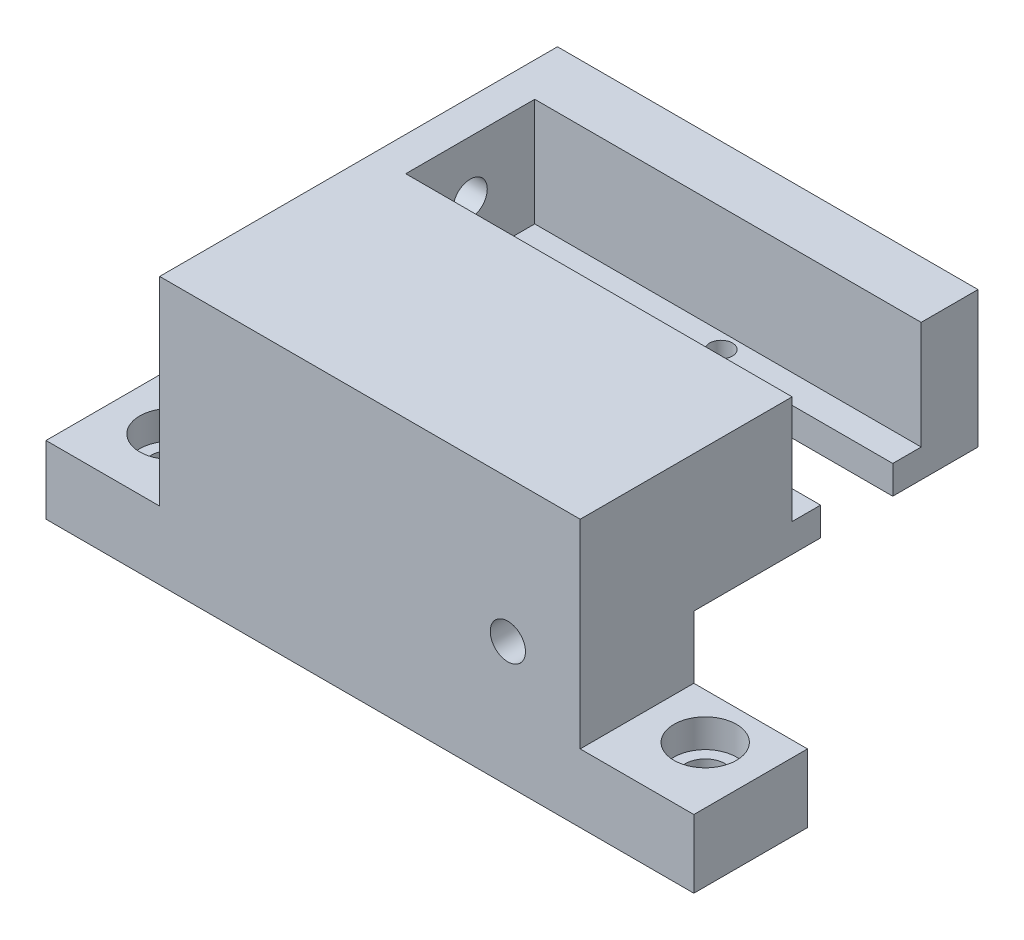
ISO-10303-21;
HEADER;
FILE_DESCRIPTION(('STEP AP214'),'2;1');
FILE_NAME('part.step','',(''),(''),'','','');
FILE_SCHEMA(('AUTOMOTIVE_DESIGN { 1 0 10303 214 1 1 1 1 }'));
ENDSEC;
DATA;
#1=APPLICATION_CONTEXT('core data for automotive mechanical design processes');
#2=APPLICATION_PROTOCOL_DEFINITION('international standard','automotive_design',2000,#1);
#3=PRODUCT_CONTEXT('',#1,'mechanical');
#4=PRODUCT('Part','Part','',(#3));
#5=PRODUCT_RELATED_PRODUCT_CATEGORY('part','',(#4));
#6=PRODUCT_DEFINITION_FORMATION('','',#4);
#7=PRODUCT_DEFINITION_CONTEXT('part definition',#1,'design');
#8=PRODUCT_DEFINITION('design','',#6,#7);
#9=PRODUCT_DEFINITION_SHAPE('','',#8);
#10=(LENGTH_UNIT() NAMED_UNIT(*) SI_UNIT(.MILLI.,.METRE.));
#11=(NAMED_UNIT(*) PLANE_ANGLE_UNIT() SI_UNIT($,.RADIAN.));
#12=(NAMED_UNIT(*) SI_UNIT($,.STERADIAN.) SOLID_ANGLE_UNIT());
#13=UNCERTAINTY_MEASURE_WITH_UNIT(LENGTH_MEASURE(1.E-05),#10,'distance_accuracy_value','');
#14=(GEOMETRIC_REPRESENTATION_CONTEXT(3) GLOBAL_UNCERTAINTY_ASSIGNED_CONTEXT((#13)) GLOBAL_UNIT_ASSIGNED_CONTEXT((#10,
#11,#12)) REPRESENTATION_CONTEXT('',''));
#15=CARTESIAN_POINT('',(0.,0.,0.));
#16=DIRECTION('',(0.,0.,1.));
#17=DIRECTION('',(1.,0.,0.));
#18=AXIS2_PLACEMENT_3D('',#15,#16,#17);
#19=CARTESIAN_POINT('',(37.,47.,-35.));
#20=DIRECTION('',(-1.,0.,0.));
#21=DIRECTION('',(0.,0.,1.));
#22=AXIS2_PLACEMENT_3D('',#19,#20,#21);
#23=PLANE('',#22);
#24=DIRECTION('',(0.,0.,-1.));
#25=VECTOR('',#24,1.);
#26=CARTESIAN_POINT('',(37.,23.,15.));
#27=LINE('',#26,#25);
#28=CARTESIAN_POINT('',(37.,23.,15.));
#29=VERTEX_POINT('',#28);
#30=CARTESIAN_POINT('',(37.,23.,-7.3));
#31=VERTEX_POINT('',#30);
#32=EDGE_CURVE('E357',#29,#31,#27,.T.);
#33=ORIENTED_EDGE('',*,*,#32,.T.);
#34=DIRECTION('',(0.,-1.,0.));
#35=VECTOR('',#34,1.);
#36=CARTESIAN_POINT('',(37.,28.,-7.3));
#37=LINE('',#36,#35);
#38=CARTESIAN_POINT('',(37.,28.,-7.3));
#39=VERTEX_POINT('',#38);
#40=EDGE_CURVE('E460',#39,#31,#37,.T.);
#41=ORIENTED_EDGE('',*,*,#40,.F.);
#42=DIRECTION('',(0.,0.,-1.));
#43=VECTOR('',#42,1.);
#44=CARTESIAN_POINT('',(37.,28.,-2.3));
#45=LINE('',#44,#43);
#46=CARTESIAN_POINT('',(37.,28.,-2.3));
#47=VERTEX_POINT('',#46);
#48=EDGE_CURVE('E388',#47,#39,#45,.T.);
#49=ORIENTED_EDGE('',*,*,#48,.F.);
#50=DIRECTION('',(0.,-1.,0.));
#51=VECTOR('',#50,1.);
#52=CARTESIAN_POINT('',(37.,47.,-2.3));
#53=LINE('',#52,#51);
#54=CARTESIAN_POINT('',(37.,47.,-2.3));
#55=VERTEX_POINT('',#54);
#56=EDGE_CURVE('E361',#55,#47,#53,.T.);
#57=ORIENTED_EDGE('',*,*,#56,.F.);
#58=DIRECTION('',(0.,0.,-1.));
#59=VECTOR('',#58,1.);
#60=CARTESIAN_POINT('',(37.,47.,-35.));
#61=LINE('',#60,#59);
#62=CARTESIAN_POINT('',(37.,47.,35.));
#63=VERTEX_POINT('',#62);
#64=EDGE_CURVE('E408',#63,#55,#61,.T.);
#65=ORIENTED_EDGE('',*,*,#64,.F.);
#66=DIRECTION('',(0.,-1.,0.));
#67=VECTOR('',#66,1.);
#68=CARTESIAN_POINT('',(37.,47.,35.));
#69=LINE('',#68,#67);
#70=CARTESIAN_POINT('',(37.,12.,35.));
#71=VERTEX_POINT('',#70);
#72=EDGE_CURVE('E422',#63,#71,#69,.T.);
#73=ORIENTED_EDGE('',*,*,#72,.T.);
#74=DIRECTION('',(0.,0.,1.));
#75=VECTOR('',#74,1.);
#76=CARTESIAN_POINT('',(37.,12.,35.));
#77=LINE('',#76,#75);
#78=CARTESIAN_POINT('',(37.,12.,15.));
#79=VERTEX_POINT('',#78);
#80=EDGE_CURVE('E290',#79,#71,#77,.T.);
#81=ORIENTED_EDGE('',*,*,#80,.F.);
#82=DIRECTION('',(0.,-1.,0.));
#83=VECTOR('',#82,1.);
#84=CARTESIAN_POINT('',(37.,0.,15.));
#85=LINE('',#84,#83);
#86=EDGE_CURVE('E333',#29,#79,#85,.T.);
#87=ORIENTED_EDGE('',*,*,#86,.F.);
#88=EDGE_LOOP('',(#33,#41,#49,#57,#65,#73,#81,#87));
#89=FACE_BOUND('',#88,.T.);
#90=ADVANCED_FACE('F41',(#89),#23,.F.);
#91=CARTESIAN_POINT('',(-47.,-8.,-23.));
#92=DIRECTION('',(0.,1.,0.));
#93=DIRECTION('',(0.,0.,1.));
#94=AXIS2_PLACEMENT_3D('',#91,#92,#93);
#95=CYLINDRICAL_SURFACE('',#94,3.5);
#96=CARTESIAN_POINT('',(-47.,0.,-23.));
#97=DIRECTION('',(0.,1.,0.));
#98=DIRECTION('',(0.,0.,1.));
#99=AXIS2_PLACEMENT_3D('',#96,#97,#98);
#100=CIRCLE('',#99,3.5);
#101=CARTESIAN_POINT('',(-47.,0.,-19.5));
#102=VERTEX_POINT('',#101);
#103=EDGE_CURVE('E262',#102,#102,#100,.T.);
#104=ORIENTED_EDGE('',*,*,#103,.F.);
#105=EDGE_LOOP('',(#104));
#106=FACE_BOUND('',#105,.T.);
#107=CARTESIAN_POINT('',(-47.,7.,-23.));
#108=DIRECTION('',(0.,1.,0.));
#109=DIRECTION('',(0.,0.,1.));
#110=AXIS2_PLACEMENT_3D('',#107,#108,#109);
#111=CIRCLE('',#110,3.5);
#112=CARTESIAN_POINT('',(-47.,7.,-19.5));
#113=VERTEX_POINT('',#112);
#114=EDGE_CURVE('E232',#113,#113,#111,.F.);
#115=ORIENTED_EDGE('',*,*,#114,.F.);
#116=EDGE_LOOP('',(#115));
#117=FACE_BOUND('',#116,.T.);
#118=ADVANCED_FACE('F560',(#106,#117),#95,.F.);
#119=CARTESIAN_POINT('',(47.,-8.,23.));
#120=DIRECTION('',(0.,1.,0.));
#121=DIRECTION('',(0.,0.,1.));
#122=AXIS2_PLACEMENT_3D('',#119,#120,#121);
#123=CYLINDRICAL_SURFACE('',#122,3.5);
#124=CARTESIAN_POINT('',(47.,0.,23.));
#125=DIRECTION('',(0.,1.,0.));
#126=DIRECTION('',(0.,0.,1.));
#127=AXIS2_PLACEMENT_3D('',#124,#125,#126);
#128=CIRCLE('',#127,3.5);
#129=CARTESIAN_POINT('',(47.,0.,26.5));
#130=VERTEX_POINT('',#129);
#131=EDGE_CURVE('E254',#130,#130,#128,.T.);
#132=ORIENTED_EDGE('',*,*,#131,.F.);
#133=EDGE_LOOP('',(#132));
#134=FACE_BOUND('',#133,.T.);
#135=CARTESIAN_POINT('',(47.,7.,23.));
#136=DIRECTION('',(0.,1.,0.));
#137=DIRECTION('',(0.,0.,1.));
#138=AXIS2_PLACEMENT_3D('',#135,#136,#137);
#139=CIRCLE('',#138,3.5);
#140=CARTESIAN_POINT('',(47.,7.,26.5));
#141=VERTEX_POINT('',#140);
#142=EDGE_CURVE('E240',#141,#141,#139,.F.);
#143=ORIENTED_EDGE('',*,*,#142,.F.);
#144=EDGE_LOOP('',(#143));
#145=FACE_BOUND('',#144,.T.);
#146=ADVANCED_FACE('F555',(#134,#145),#123,.F.);
#147=CARTESIAN_POINT('',(-47.,-8.,23.));
#148=DIRECTION('',(0.,1.,0.));
#149=DIRECTION('',(0.,0.,1.));
#150=AXIS2_PLACEMENT_3D('',#147,#148,#149);
#151=CYLINDRICAL_SURFACE('',#150,3.5);
#152=CARTESIAN_POINT('',(-47.,0.,23.));
#153=DIRECTION('',(0.,1.,0.));
#154=DIRECTION('',(0.,0.,1.));
#155=AXIS2_PLACEMENT_3D('',#152,#153,#154);
#156=CIRCLE('',#155,3.5);
#157=CARTESIAN_POINT('',(-47.,0.,26.5));
#158=VERTEX_POINT('',#157);
#159=EDGE_CURVE('E258',#158,#158,#156,.F.);
#160=ORIENTED_EDGE('',*,*,#159,.T.);
#161=EDGE_LOOP('',(#160));
#162=FACE_BOUND('',#161,.T.);
#163=CARTESIAN_POINT('',(-47.,7.,23.));
#164=DIRECTION('',(0.,1.,0.));
#165=DIRECTION('',(0.,0.,1.));
#166=AXIS2_PLACEMENT_3D('',#163,#164,#165);
#167=CIRCLE('',#166,3.5);
#168=CARTESIAN_POINT('',(-47.,7.,26.5));
#169=VERTEX_POINT('',#168);
#170=EDGE_CURVE('E249',#169,#169,#167,.T.);
#171=ORIENTED_EDGE('',*,*,#170,.T.);
#172=EDGE_LOOP('',(#171));
#173=FACE_BOUND('',#172,.T.);
#174=ADVANCED_FACE('F548',(#162,#173),#151,.F.);
#175=CARTESIAN_POINT('',(-37.,47.,-35.));
#176=DIRECTION('',(1.,0.,0.));
#177=DIRECTION('',(0.,0.,-1.));
#178=AXIS2_PLACEMENT_3D('',#175,#176,#177);
#179=PLANE('',#178);
#180=CARTESIAN_POINT('',(-37.,37.5,-13.65));
#181=DIRECTION('',(1.,0.,0.));
#182=DIRECTION('',(0.,0.,-1.));
#183=AXIS2_PLACEMENT_3D('',#180,#181,#182);
#184=CIRCLE('',#183,3.);
#185=CARTESIAN_POINT('',(-37.,37.5,-16.65));
#186=VERTEX_POINT('',#185);
#187=EDGE_CURVE('E223',#186,#186,#184,.T.);
#188=ORIENTED_EDGE('',*,*,#187,.T.);
#189=EDGE_LOOP('',(#188));
#190=FACE_BOUND('',#189,.T.);
#191=DIRECTION('',(0.,0.,-1.));
#192=VECTOR('',#191,1.);
#193=CARTESIAN_POINT('',(-37.,12.,-35.));
#194=LINE('',#193,#192);
#195=CARTESIAN_POINT('',(-37.,12.,35.));
#196=VERTEX_POINT('',#195);
#197=CARTESIAN_POINT('',(-37.,12.,-35.));
#198=VERTEX_POINT('',#197);
#199=EDGE_CURVE('E67',#196,#198,#194,.T.);
#200=ORIENTED_EDGE('',*,*,#199,.F.);
#201=DIRECTION('',(0.,-1.,0.));
#202=VECTOR('',#201,1.);
#203=CARTESIAN_POINT('',(-37.,47.,35.));
#204=LINE('',#203,#202);
#205=CARTESIAN_POINT('',(-37.,47.,35.));
#206=VERTEX_POINT('',#205);
#207=EDGE_CURVE('E430',#206,#196,#204,.T.);
#208=ORIENTED_EDGE('',*,*,#207,.F.);
#209=DIRECTION('',(0.,0.,1.));
#210=VECTOR('',#209,1.);
#211=CARTESIAN_POINT('',(-37.,47.,-35.));
#212=LINE('',#211,#210);
#213=CARTESIAN_POINT('',(-37.,47.,-35.));
#214=VERTEX_POINT('',#213);
#215=EDGE_CURVE('E416',#214,#206,#212,.T.);
#216=ORIENTED_EDGE('',*,*,#215,.F.);
#217=DIRECTION('',(0.,-1.,0.));
#218=VECTOR('',#217,1.);
#219=CARTESIAN_POINT('',(-37.,47.,-35.));
#220=LINE('',#219,#218);
#221=EDGE_CURVE('E433',#214,#198,#220,.T.);
#222=ORIENTED_EDGE('',*,*,#221,.T.);
#223=EDGE_LOOP('',(#200,#208,#216,#222));
#224=FACE_BOUND('',#223,.T.);
#225=ADVANCED_FACE('F546',(#190,#224),#179,.F.);
#226=CARTESIAN_POINT('',(37.,28.,-20.));
#227=VERTEX_POINT('',#226);
#228=CARTESIAN_POINT('',(37.,28.,-25.));
#229=VERTEX_POINT('',#228);
#230=EDGE_CURVE('E387',#227,#229,#45,.T.);
#231=ORIENTED_EDGE('',*,*,#230,.F.);
#232=DIRECTION('',(0.,1.,0.));
#233=VECTOR('',#232,1.);
#234=CARTESIAN_POINT('',(37.,28.,-20.));
#235=LINE('',#234,#233);
#236=CARTESIAN_POINT('',(37.,23.,-20.));
#237=VERTEX_POINT('',#236);
#238=EDGE_CURVE('E471',#237,#227,#235,.T.);
#239=ORIENTED_EDGE('',*,*,#238,.F.);
#240=CARTESIAN_POINT('',(37.,23.,-35.));
#241=VERTEX_POINT('',#240);
#242=EDGE_CURVE('E208',#237,#241,#27,.T.);
#243=ORIENTED_EDGE('',*,*,#242,.T.);
#244=DIRECTION('',(0.,-1.,0.));
#245=VECTOR('',#244,1.);
#246=CARTESIAN_POINT('',(37.,47.,-35.));
#247=LINE('',#246,#245);
#248=CARTESIAN_POINT('',(37.,47.,-35.));
#249=VERTEX_POINT('',#248);
#250=EDGE_CURVE('E436',#249,#241,#247,.T.);
#251=ORIENTED_EDGE('',*,*,#250,.F.);
#252=CARTESIAN_POINT('',(37.,47.,-25.));
#253=VERTEX_POINT('',#252);
#254=EDGE_CURVE('E413',#253,#249,#61,.T.);
#255=ORIENTED_EDGE('',*,*,#254,.F.);
#256=DIRECTION('',(0.,1.,0.));
#257=VECTOR('',#256,1.);
#258=CARTESIAN_POINT('',(37.,47.,-25.));
#259=LINE('',#258,#257);
#260=EDGE_CURVE('E372',#229,#253,#259,.T.);
#261=ORIENTED_EDGE('',*,*,#260,.F.);
#262=EDGE_LOOP('',(#231,#239,#243,#251,#255,#261));
#263=FACE_BOUND('',#262,.T.);
#264=ADVANCED_FACE('F43',(#263),#23,.F.);
#265=CARTESIAN_POINT('',(-37.,47.,-35.));
#266=DIRECTION('',(0.,0.,1.));
#267=DIRECTION('',(1.,0.,0.));
#268=AXIS2_PLACEMENT_3D('',#265,#266,#267);
#269=PLANE('',#268);
#270=ORIENTED_EDGE('',*,*,#250,.T.);
#271=DIRECTION('',(1.,0.,0.));
#272=VECTOR('',#271,1.);
#273=CARTESIAN_POINT('',(37.,23.,-35.));
#274=LINE('',#273,#272);
#275=CARTESIAN_POINT('',(-13.,23.,-35.));
#276=VERTEX_POINT('',#275);
#277=EDGE_CURVE('E338',#276,#241,#274,.T.);
#278=ORIENTED_EDGE('',*,*,#277,.F.);
#279=DIRECTION('',(0.,1.,0.));
#280=VECTOR('',#279,1.);
#281=CARTESIAN_POINT('',(-13.,0.,-35.));
#282=LINE('',#281,#280);
#283=CARTESIAN_POINT('',(-13.,0.,-35.));
#284=VERTEX_POINT('',#283);
#285=EDGE_CURVE('E332',#284,#276,#282,.T.);
#286=ORIENTED_EDGE('',*,*,#285,.F.);
#287=DIRECTION('',(-1.,0.,0.));
#288=VECTOR('',#287,1.);
#289=CARTESIAN_POINT('',(-37.,0.,-35.));
#290=LINE('',#289,#288);
#291=CARTESIAN_POINT('',(-57.,0.,-35.));
#292=VERTEX_POINT('',#291);
#293=EDGE_CURVE('E397',#284,#292,#290,.T.);
#294=ORIENTED_EDGE('',*,*,#293,.T.);
#295=DIRECTION('',(0.,-1.,0.));
#296=VECTOR('',#295,1.);
#297=CARTESIAN_POINT('',(-57.,0.,-35.));
#298=LINE('',#297,#296);
#299=CARTESIAN_POINT('',(-57.,12.,-35.));
#300=VERTEX_POINT('',#299);
#301=EDGE_CURVE('E266',#300,#292,#298,.T.);
#302=ORIENTED_EDGE('',*,*,#301,.F.);
#303=DIRECTION('',(1.,0.,0.));
#304=VECTOR('',#303,1.);
#305=CARTESIAN_POINT('',(-57.,12.,-35.));
#306=LINE('',#305,#304);
#307=EDGE_CURVE('E280',#300,#198,#306,.T.);
#308=ORIENTED_EDGE('',*,*,#307,.T.);
#309=ORIENTED_EDGE('',*,*,#221,.F.);
#310=DIRECTION('',(-1.,0.,0.));
#311=VECTOR('',#310,1.);
#312=CARTESIAN_POINT('',(-37.,47.,-35.));
#313=LINE('',#312,#311);
#314=EDGE_CURVE('E412',#249,#214,#313,.T.);
#315=ORIENTED_EDGE('',*,*,#314,.F.);
#316=EDGE_LOOP('',(#270,#278,#286,#294,#302,#308,#309,#315));
#317=FACE_BOUND('',#316,.T.);
#318=ADVANCED_FACE('F525',(#317),#269,.F.);
#319=CARTESIAN_POINT('',(-37.,47.,35.));
#320=DIRECTION('',(0.,0.,-1.));
#321=DIRECTION('',(-1.,0.,0.));
#322=AXIS2_PLACEMENT_3D('',#319,#320,#321);
#323=PLANE('',#322);
#324=CARTESIAN_POINT('',(24.27,22.,35.));
#325=DIRECTION('',(0.,0.,1.));
#326=DIRECTION('',(1.,0.,0.));
#327=AXIS2_PLACEMENT_3D('',#324,#325,#326);
#328=CIRCLE('',#327,3.1);
#329=CARTESIAN_POINT('',(27.37,22.,35.));
#330=VERTEX_POINT('',#329);
#331=EDGE_CURVE('E316',#330,#330,#328,.T.);
#332=ORIENTED_EDGE('',*,*,#331,.F.);
#333=EDGE_LOOP('',(#332));
#334=FACE_BOUND('',#333,.T.);
#335=DIRECTION('',(1.,0.,0.));
#336=VECTOR('',#335,1.);
#337=CARTESIAN_POINT('',(-37.,0.,35.));
#338=LINE('',#337,#336);
#339=CARTESIAN_POINT('',(-57.,0.,35.));
#340=VERTEX_POINT('',#339);
#341=CARTESIAN_POINT('',(57.,0.,35.));
#342=VERTEX_POINT('',#341);
#343=EDGE_CURVE('E425',#340,#342,#338,.T.);
#344=ORIENTED_EDGE('',*,*,#343,.T.);
#345=DIRECTION('',(0.,-1.,0.));
#346=VECTOR('',#345,1.);
#347=CARTESIAN_POINT('',(57.,0.,35.));
#348=LINE('',#347,#346);
#349=CARTESIAN_POINT('',(57.,12.,35.));
#350=VERTEX_POINT('',#349);
#351=EDGE_CURVE('E291',#350,#342,#348,.T.);
#352=ORIENTED_EDGE('',*,*,#351,.F.);
#353=DIRECTION('',(-1.,0.,0.));
#354=VECTOR('',#353,1.);
#355=CARTESIAN_POINT('',(57.,12.,35.));
#356=LINE('',#355,#354);
#357=EDGE_CURVE('E305',#350,#71,#356,.T.);
#358=ORIENTED_EDGE('',*,*,#357,.T.);
#359=ORIENTED_EDGE('',*,*,#72,.F.);
#360=DIRECTION('',(1.,0.,0.));
#361=VECTOR('',#360,1.);
#362=CARTESIAN_POINT('',(-37.,47.,35.));
#363=LINE('',#362,#361);
#364=EDGE_CURVE('E419',#206,#63,#363,.T.);
#365=ORIENTED_EDGE('',*,*,#364,.F.);
#366=ORIENTED_EDGE('',*,*,#207,.T.);
#367=DIRECTION('',(1.,0.,0.));
#368=VECTOR('',#367,1.);
#369=CARTESIAN_POINT('',(-57.,12.,35.));
#370=LINE('',#369,#368);
#371=CARTESIAN_POINT('',(-57.,12.,35.));
#372=VERTEX_POINT('',#371);
#373=EDGE_CURVE('E286',#372,#196,#370,.T.);
#374=ORIENTED_EDGE('',*,*,#373,.F.);
#375=DIRECTION('',(0.,1.,0.));
#376=VECTOR('',#375,1.);
#377=CARTESIAN_POINT('',(-57.,0.,35.));
#378=LINE('',#377,#376);
#379=EDGE_CURVE('E274',#340,#372,#378,.T.);
#380=ORIENTED_EDGE('',*,*,#379,.F.);
#381=EDGE_LOOP('',(#344,#352,#358,#359,#365,#366,#374,#380));
#382=FACE_BOUND('',#381,.T.);
#383=ADVANCED_FACE('F502',(#334,#382),#323,.F.);
#384=CARTESIAN_POINT('',(0.,47.,0.));
#385=DIRECTION('',(0.,1.,0.));
#386=DIRECTION('',(0.,0.,1.));
#387=AXIS2_PLACEMENT_3D('',#384,#385,#386);
#388=PLANE('',#387);
#389=DIRECTION('',(1.,0.,0.));
#390=VECTOR('',#389,1.);
#391=CARTESIAN_POINT('',(-31.,47.,-2.29999999999999));
#392=LINE('',#391,#390);
#393=CARTESIAN_POINT('',(-31.,47.,-2.29999999999999));
#394=VERTEX_POINT('',#393);
#395=EDGE_CURVE('E394',#394,#55,#392,.T.);
#396=ORIENTED_EDGE('',*,*,#395,.F.);
#397=DIRECTION('',(0.,0.,1.));
#398=VECTOR('',#397,1.);
#399=CARTESIAN_POINT('',(-31.,47.,-2.29999999999999));
#400=LINE('',#399,#398);
#401=CARTESIAN_POINT('',(-31.,47.,-25.));
#402=VERTEX_POINT('',#401);
#403=EDGE_CURVE('E379',#402,#394,#400,.T.);
#404=ORIENTED_EDGE('',*,*,#403,.F.);
#405=DIRECTION('',(1.,0.,0.));
#406=VECTOR('',#405,1.);
#407=CARTESIAN_POINT('',(-31.,47.,-25.));
#408=LINE('',#407,#406);
#409=EDGE_CURVE('E398',#402,#253,#408,.T.);
#410=ORIENTED_EDGE('',*,*,#409,.T.);
#411=ORIENTED_EDGE('',*,*,#254,.T.);
#412=ORIENTED_EDGE('',*,*,#314,.T.);
#413=ORIENTED_EDGE('',*,*,#215,.T.);
#414=ORIENTED_EDGE('',*,*,#364,.T.);
#415=ORIENTED_EDGE('',*,*,#64,.T.);
#416=EDGE_LOOP('',(#396,#404,#410,#411,#412,#413,#414,#415));
#417=FACE_BOUND('',#416,.T.);
#418=ADVANCED_FACE('F496',(#417),#388,.T.);
#419=CARTESIAN_POINT('',(0.,0.,0.));
#420=DIRECTION('',(0.,1.,0.));
#421=DIRECTION('',(0.,0.,1.));
#422=AXIS2_PLACEMENT_3D('',#419,#420,#421);
#423=PLANE('',#422);
#424=ORIENTED_EDGE('',*,*,#131,.T.);
#425=EDGE_LOOP('',(#424));
#426=FACE_BOUND('',#425,.T.);
#427=ORIENTED_EDGE('',*,*,#159,.F.);
#428=EDGE_LOOP('',(#427));
#429=FACE_BOUND('',#428,.T.);
#430=ORIENTED_EDGE('',*,*,#103,.T.);
#431=EDGE_LOOP('',(#430));
#432=FACE_BOUND('',#431,.T.);
#433=ORIENTED_EDGE('',*,*,#293,.F.);
#434=DIRECTION('',(0.,0.,-1.));
#435=VECTOR('',#434,1.);
#436=CARTESIAN_POINT('',(-13.,0.,15.));
#437=LINE('',#436,#435);
#438=CARTESIAN_POINT('',(-13.,0.,15.));
#439=VERTEX_POINT('',#438);
#440=EDGE_CURVE('E351',#439,#284,#437,.T.);
#441=ORIENTED_EDGE('',*,*,#440,.F.);
#442=DIRECTION('',(-1.,0.,0.));
#443=VECTOR('',#442,1.);
#444=CARTESIAN_POINT('',(37.,0.,15.));
#445=LINE('',#444,#443);
#446=CARTESIAN_POINT('',(57.,0.,15.));
#447=VERTEX_POINT('',#446);
#448=EDGE_CURVE('E337',#447,#439,#445,.T.);
#449=ORIENTED_EDGE('',*,*,#448,.F.);
#450=DIRECTION('',(0.,0.,-1.));
#451=VECTOR('',#450,1.);
#452=CARTESIAN_POINT('',(57.,0.,35.));
#453=LINE('',#452,#451);
#454=EDGE_CURVE('E295',#342,#447,#453,.T.);
#455=ORIENTED_EDGE('',*,*,#454,.F.);
#456=ORIENTED_EDGE('',*,*,#343,.F.);
#457=DIRECTION('',(0.,0.,1.));
#458=VECTOR('',#457,1.);
#459=CARTESIAN_POINT('',(-57.,0.,-35.));
#460=LINE('',#459,#458);
#461=EDGE_CURVE('E270',#292,#340,#460,.T.);
#462=ORIENTED_EDGE('',*,*,#461,.F.);
#463=EDGE_LOOP('',(#433,#441,#449,#455,#456,#462));
#464=FACE_BOUND('',#463,.T.);
#465=ADVANCED_FACE('F536',(#426,#429,#432,#464),#423,.F.);
#466=CARTESIAN_POINT('',(-31.,47.,-2.29999999999999));
#467=DIRECTION('',(0.,0.,1.));
#468=DIRECTION('',(1.,0.,0.));
#469=AXIS2_PLACEMENT_3D('',#466,#467,#468);
#470=PLANE('',#469);
#471=ORIENTED_EDGE('',*,*,#56,.T.);
#472=DIRECTION('',(1.,0.,0.));
#473=VECTOR('',#472,1.);
#474=CARTESIAN_POINT('',(-31.,28.,-2.29999999999999));
#475=LINE('',#474,#473);
#476=CARTESIAN_POINT('',(-31.,28.,-2.29999999999999));
#477=VERTEX_POINT('',#476);
#478=EDGE_CURVE('E383',#477,#47,#475,.T.);
#479=ORIENTED_EDGE('',*,*,#478,.F.);
#480=DIRECTION('',(0.,-1.,0.));
#481=VECTOR('',#480,1.);
#482=CARTESIAN_POINT('',(-31.,47.,-2.29999999999999));
#483=LINE('',#482,#481);
#484=EDGE_CURVE('E367',#394,#477,#483,.T.);
#485=ORIENTED_EDGE('',*,*,#484,.F.);
#486=ORIENTED_EDGE('',*,*,#395,.T.);
#487=EDGE_LOOP('',(#471,#479,#485,#486));
#488=FACE_BOUND('',#487,.T.);
#489=ADVANCED_FACE('F492',(#488),#470,.F.);
#490=CARTESIAN_POINT('',(-31.,47.,-25.));
#491=DIRECTION('',(0.,0.,-1.));
#492=DIRECTION('',(0.,1.,0.));
#493=AXIS2_PLACEMENT_3D('',#490,#491,#492);
#494=PLANE('',#493);
#495=ORIENTED_EDGE('',*,*,#260,.T.);
#496=ORIENTED_EDGE('',*,*,#409,.F.);
#497=DIRECTION('',(0.,1.,0.));
#498=VECTOR('',#497,1.);
#499=CARTESIAN_POINT('',(-31.,47.,-25.));
#500=LINE('',#499,#498);
#501=CARTESIAN_POINT('',(-31.,28.,-25.));
#502=VERTEX_POINT('',#501);
#503=EDGE_CURVE('E376',#502,#402,#500,.T.);
#504=ORIENTED_EDGE('',*,*,#503,.F.);
#505=DIRECTION('',(1.,0.,0.));
#506=VECTOR('',#505,1.);
#507=CARTESIAN_POINT('',(-31.,28.,-25.));
#508=LINE('',#507,#506);
#509=EDGE_CURVE('E402',#502,#229,#508,.T.);
#510=ORIENTED_EDGE('',*,*,#509,.T.);
#511=EDGE_LOOP('',(#495,#496,#504,#510));
#512=FACE_BOUND('',#511,.T.);
#513=ADVANCED_FACE('F607',(#512),#494,.F.);
#514=CARTESIAN_POINT('',(-31.,28.,-2.29999999999999));
#515=DIRECTION('',(0.,-1.,0.));
#516=DIRECTION('',(0.,0.,-1.));
#517=AXIS2_PLACEMENT_3D('',#514,#515,#516);
#518=PLANE('',#517);
#519=CARTESIAN_POINT('',(4.52999999999999,28.,-5.04999999999999));
#520=DIRECTION('',(0.,1.,0.));
#521=DIRECTION('',(0.,0.,1.));
#522=AXIS2_PLACEMENT_3D('',#519,#520,#521);
#523=CIRCLE('',#522,2.);
#524=CARTESIAN_POINT('',(4.52999999999999,28.,-3.04999999999999));
#525=VERTEX_POINT('',#524);
#526=EDGE_CURVE('E454',#525,#525,#523,.T.);
#527=ORIENTED_EDGE('',*,*,#526,.F.);
#528=EDGE_LOOP('',(#527));
#529=FACE_BOUND('',#528,.T.);
#530=CARTESIAN_POINT('',(4.52999999999999,28.,-22.25));
#531=DIRECTION('',(0.,1.,0.));
#532=DIRECTION('',(0.,0.,1.));
#533=AXIS2_PLACEMENT_3D('',#530,#531,#532);
#534=CIRCLE('',#533,2.);
#535=CARTESIAN_POINT('',(4.52999999999999,28.,-20.25));
#536=VERTEX_POINT('',#535);
#537=EDGE_CURVE('E462',#536,#536,#534,.T.);
#538=ORIENTED_EDGE('',*,*,#537,.F.);
#539=EDGE_LOOP('',(#538));
#540=FACE_BOUND('',#539,.T.);
#541=ORIENTED_EDGE('',*,*,#48,.T.);
#542=DIRECTION('',(1.,0.,0.));
#543=VECTOR('',#542,1.);
#544=CARTESIAN_POINT('',(17.,28.,-7.29999999999999));
#545=LINE('',#544,#543);
#546=CARTESIAN_POINT('',(17.,28.,-7.29999999999999));
#547=VERTEX_POINT('',#546);
#548=EDGE_CURVE('E214',#547,#39,#545,.T.);
#549=ORIENTED_EDGE('',*,*,#548,.F.);
#550=DIRECTION('',(0.,0.,1.));
#551=VECTOR('',#550,1.);
#552=CARTESIAN_POINT('',(17.,28.,-7.29999999999999));
#553=LINE('',#552,#551);
#554=CARTESIAN_POINT('',(17.,28.,-20.));
#555=VERTEX_POINT('',#554);
#556=EDGE_CURVE('E196',#555,#547,#553,.T.);
#557=ORIENTED_EDGE('',*,*,#556,.F.);
#558=DIRECTION('',(1.,0.,0.));
#559=VECTOR('',#558,1.);
#560=CARTESIAN_POINT('',(17.,28.,-20.));
#561=LINE('',#560,#559);
#562=EDGE_CURVE('E193',#555,#227,#561,.T.);
#563=ORIENTED_EDGE('',*,*,#562,.T.);
#564=ORIENTED_EDGE('',*,*,#230,.T.);
#565=ORIENTED_EDGE('',*,*,#509,.F.);
#566=DIRECTION('',(0.,0.,-1.));
#567=VECTOR('',#566,1.);
#568=CARTESIAN_POINT('',(-31.,28.,-2.29999999999999));
#569=LINE('',#568,#567);
#570=EDGE_CURVE('E371',#477,#502,#569,.T.);
#571=ORIENTED_EDGE('',*,*,#570,.F.);
#572=ORIENTED_EDGE('',*,*,#478,.T.);
#573=EDGE_LOOP('',(#541,#549,#557,#563,#564,#565,#571,#572));
#574=FACE_BOUND('',#573,.T.);
#575=ADVANCED_FACE('F489',(#529,#540,#574),#518,.F.);
#576=CARTESIAN_POINT('',(-31.,0.,0.));
#577=DIRECTION('',(1.,0.,0.));
#578=DIRECTION('',(0.,0.,-1.));
#579=AXIS2_PLACEMENT_3D('',#576,#577,#578);
#580=PLANE('',#579);
#581=CARTESIAN_POINT('',(-31.,37.5,-13.65));
#582=DIRECTION('',(1.,0.,0.));
#583=DIRECTION('',(0.,0.,-1.));
#584=AXIS2_PLACEMENT_3D('',#581,#582,#583);
#585=CIRCLE('',#584,3.);
#586=CARTESIAN_POINT('',(-31.,37.5,-16.65));
#587=VERTEX_POINT('',#586);
#588=EDGE_CURVE('E219',#587,#587,#585,.T.);
#589=ORIENTED_EDGE('',*,*,#588,.F.);
#590=EDGE_LOOP('',(#589));
#591=FACE_BOUND('',#590,.T.);
#592=ORIENTED_EDGE('',*,*,#484,.T.);
#593=ORIENTED_EDGE('',*,*,#570,.T.);
#594=ORIENTED_EDGE('',*,*,#503,.T.);
#595=ORIENTED_EDGE('',*,*,#403,.T.);
#596=EDGE_LOOP('',(#592,#593,#594,#595));
#597=FACE_BOUND('',#596,.T.);
#598=ADVANCED_FACE('F600',(#591,#597),#580,.T.);
#599=CARTESIAN_POINT('',(37.,23.,15.));
#600=DIRECTION('',(0.,1.,0.));
#601=DIRECTION('',(0.,0.,1.));
#602=AXIS2_PLACEMENT_3D('',#599,#600,#601);
#603=PLANE('',#602);
#604=CARTESIAN_POINT('',(4.52999999999999,23.,-5.04999999999999));
#605=DIRECTION('',(0.,1.,0.));
#606=DIRECTION('',(0.,0.,1.));
#607=AXIS2_PLACEMENT_3D('',#604,#605,#606);
#608=CIRCLE('',#607,2.);
#609=CARTESIAN_POINT('',(4.52999999999999,23.,-3.04999999999999));
#610=VERTEX_POINT('',#609);
#611=EDGE_CURVE('E45',#610,#610,#608,.T.);
#612=ORIENTED_EDGE('',*,*,#611,.T.);
#613=EDGE_LOOP('',(#612));
#614=FACE_BOUND('',#613,.T.);
#615=CARTESIAN_POINT('',(4.52999999999999,23.,-22.25));
#616=DIRECTION('',(0.,1.,0.));
#617=DIRECTION('',(0.,0.,1.));
#618=AXIS2_PLACEMENT_3D('',#615,#616,#617);
#619=CIRCLE('',#618,2.);
#620=CARTESIAN_POINT('',(4.52999999999999,23.,-20.25));
#621=VERTEX_POINT('',#620);
#622=EDGE_CURVE('E451',#621,#621,#619,.T.);
#623=ORIENTED_EDGE('',*,*,#622,.T.);
#624=EDGE_LOOP('',(#623));
#625=FACE_BOUND('',#624,.T.);
#626=DIRECTION('',(0.,0.,-1.));
#627=VECTOR('',#626,1.);
#628=CARTESIAN_POINT('',(17.,23.,-7.3));
#629=LINE('',#628,#627);
#630=CARTESIAN_POINT('',(17.,23.,-7.3));
#631=VERTEX_POINT('',#630);
#632=CARTESIAN_POINT('',(17.,23.,-20.));
#633=VERTEX_POINT('',#632);
#634=EDGE_CURVE('E197',#631,#633,#629,.T.);
#635=ORIENTED_EDGE('',*,*,#634,.F.);
#636=DIRECTION('',(1.,0.,0.));
#637=VECTOR('',#636,1.);
#638=CARTESIAN_POINT('',(17.,23.,-7.3));
#639=LINE('',#638,#637);
#640=EDGE_CURVE('E210',#631,#31,#639,.T.);
#641=ORIENTED_EDGE('',*,*,#640,.T.);
#642=ORIENTED_EDGE('',*,*,#32,.F.);
#643=DIRECTION('',(1.,0.,0.));
#644=VECTOR('',#643,1.);
#645=CARTESIAN_POINT('',(37.,23.,15.));
#646=LINE('',#645,#644);
#647=CARTESIAN_POINT('',(27.2042801502242,23.,15.));
#648=VERTEX_POINT('',#647);
#649=EDGE_CURVE('E346',#648,#29,#646,.T.);
#650=ORIENTED_EDGE('',*,*,#649,.F.);
#651=DIRECTION('',(0.,0.,1.));
#652=VECTOR('',#651,1.);
#653=CARTESIAN_POINT('',(27.2042801502242,23.,10.));
#654=LINE('',#653,#652);
#655=CARTESIAN_POINT('',(27.2042801502242,23.,10.));
#656=VERTEX_POINT('',#655);
#657=EDGE_CURVE('E321',#648,#656,#654,.F.);
#658=ORIENTED_EDGE('',*,*,#657,.T.);
#659=DIRECTION('',(1.,0.,0.));
#660=VECTOR('',#659,1.);
#661=CARTESIAN_POINT('',(37.,23.,10.));
#662=LINE('',#661,#660);
#663=CARTESIAN_POINT('',(21.3357198497758,23.,10.));
#664=VERTEX_POINT('',#663);
#665=EDGE_CURVE('E11',#664,#656,#662,.T.);
#666=ORIENTED_EDGE('',*,*,#665,.F.);
#667=DIRECTION('',(0.,0.,1.));
#668=VECTOR('',#667,1.);
#669=CARTESIAN_POINT('',(21.3357198497758,23.,10.));
#670=LINE('',#669,#668);
#671=CARTESIAN_POINT('',(21.3357198497758,23.,15.));
#672=VERTEX_POINT('',#671);
#673=EDGE_CURVE('E328',#664,#672,#670,.T.);
#674=ORIENTED_EDGE('',*,*,#673,.T.);
#675=CARTESIAN_POINT('',(-13.,23.,15.));
#676=VERTEX_POINT('',#675);
#677=EDGE_CURVE('E347',#676,#672,#646,.T.);
#678=ORIENTED_EDGE('',*,*,#677,.F.);
#679=DIRECTION('',(0.,0.,-1.));
#680=VECTOR('',#679,1.);
#681=CARTESIAN_POINT('',(-13.,23.,15.));
#682=LINE('',#681,#680);
#683=EDGE_CURVE('E362',#676,#276,#682,.T.);
#684=ORIENTED_EDGE('',*,*,#683,.T.);
#685=ORIENTED_EDGE('',*,*,#277,.T.);
#686=ORIENTED_EDGE('',*,*,#242,.F.);
#687=DIRECTION('',(1.,0.,0.));
#688=VECTOR('',#687,1.);
#689=CARTESIAN_POINT('',(17.,23.,-20.));
#690=LINE('',#689,#688);
#691=EDGE_CURVE('E190',#633,#237,#690,.T.);
#692=ORIENTED_EDGE('',*,*,#691,.F.);
#693=EDGE_LOOP('',(#635,#641,#642,#650,#658,#666,#674,#678,#684,#685,#686,#692));
#694=FACE_BOUND('',#693,.T.);
#695=ADVANCED_FACE('F206',(#614,#625,#694),#603,.F.);
#696=CARTESIAN_POINT('',(-13.,0.,15.));
#697=DIRECTION('',(-1.,0.,0.));
#698=DIRECTION('',(0.,0.,1.));
#699=AXIS2_PLACEMENT_3D('',#696,#697,#698);
#700=PLANE('',#699);
#701=ORIENTED_EDGE('',*,*,#285,.T.);
#702=ORIENTED_EDGE('',*,*,#683,.F.);
#703=DIRECTION('',(0.,1.,0.));
#704=VECTOR('',#703,1.);
#705=CARTESIAN_POINT('',(-13.,0.,15.));
#706=LINE('',#705,#704);
#707=EDGE_CURVE('E342',#439,#676,#706,.T.);
#708=ORIENTED_EDGE('',*,*,#707,.F.);
#709=ORIENTED_EDGE('',*,*,#440,.T.);
#710=EDGE_LOOP('',(#701,#702,#708,#709));
#711=FACE_BOUND('',#710,.T.);
#712=ADVANCED_FACE('F597',(#711),#700,.F.);
#713=CARTESIAN_POINT('',(0.,0.,15.));
#714=DIRECTION('',(0.,0.,1.));
#715=DIRECTION('',(1.,0.,0.));
#716=AXIS2_PLACEMENT_3D('',#713,#714,#715);
#717=PLANE('',#716);
#718=ORIENTED_EDGE('',*,*,#677,.T.);
#719=CARTESIAN_POINT('',(24.27,22.,15.));
#720=DIRECTION('',(0.,0.,1.));
#721=DIRECTION('',(1.,0.,0.));
#722=AXIS2_PLACEMENT_3D('',#719,#720,#721);
#723=CIRCLE('',#722,3.1);
#724=EDGE_CURVE('E51',#672,#648,#723,.T.);
#725=ORIENTED_EDGE('',*,*,#724,.T.);
#726=ORIENTED_EDGE('',*,*,#649,.T.);
#727=ORIENTED_EDGE('',*,*,#86,.T.);
#728=DIRECTION('',(-1.,0.,0.));
#729=VECTOR('',#728,1.);
#730=CARTESIAN_POINT('',(57.,12.,15.));
#731=LINE('',#730,#729);
#732=CARTESIAN_POINT('',(57.,12.,15.));
#733=VERTEX_POINT('',#732);
#734=EDGE_CURVE('E312',#733,#79,#731,.T.);
#735=ORIENTED_EDGE('',*,*,#734,.F.);
#736=DIRECTION('',(0.,1.,0.));
#737=VECTOR('',#736,1.);
#738=CARTESIAN_POINT('',(57.,0.,15.));
#739=LINE('',#738,#737);
#740=EDGE_CURVE('E299',#447,#733,#739,.T.);
#741=ORIENTED_EDGE('',*,*,#740,.F.);
#742=ORIENTED_EDGE('',*,*,#448,.T.);
#743=ORIENTED_EDGE('',*,*,#707,.T.);
#744=EDGE_LOOP('',(#718,#725,#726,#727,#735,#741,#742,#743));
#745=FACE_BOUND('',#744,.T.);
#746=ADVANCED_FACE('F511',(#745),#717,.F.);
#747=CARTESIAN_POINT('',(24.27,22.,10.));
#748=DIRECTION('',(0.,0.,1.));
#749=DIRECTION('',(1.,0.,0.));
#750=AXIS2_PLACEMENT_3D('',#747,#748,#749);
#751=PLANE('',#750);
#752=ORIENTED_EDGE('',*,*,#665,.T.);
#753=CARTESIAN_POINT('',(24.27,22.,10.));
#754=DIRECTION('',(0.,0.,1.));
#755=DIRECTION('',(1.,0.,0.));
#756=AXIS2_PLACEMENT_3D('',#753,#754,#755);
#757=CIRCLE('',#756,3.1);
#758=EDGE_CURVE('E317',#656,#664,#757,.T.);
#759=ORIENTED_EDGE('',*,*,#758,.T.);
#760=EDGE_LOOP('',(#752,#759));
#761=FACE_BOUND('',#760,.T.);
#762=ADVANCED_FACE('F588',(#761),#751,.T.);
#763=CARTESIAN_POINT('',(24.27,22.,10.));
#764=DIRECTION('',(0.,0.,1.));
#765=DIRECTION('',(1.,0.,0.));
#766=AXIS2_PLACEMENT_3D('',#763,#764,#765);
#767=CYLINDRICAL_SURFACE('',#766,3.1);
#768=ORIENTED_EDGE('',*,*,#331,.T.);
#769=EDGE_LOOP('',(#768));
#770=FACE_BOUND('',#769,.T.);
#771=ORIENTED_EDGE('',*,*,#758,.F.);
#772=ORIENTED_EDGE('',*,*,#657,.F.);
#773=ORIENTED_EDGE('',*,*,#724,.F.);
#774=ORIENTED_EDGE('',*,*,#673,.F.);
#775=EDGE_LOOP('',(#771,#772,#773,#774));
#776=FACE_BOUND('',#775,.T.);
#777=ADVANCED_FACE('F586',(#770,#776),#767,.F.);
#778=CARTESIAN_POINT('',(57.,12.,35.));
#779=DIRECTION('',(0.,-1.,0.));
#780=DIRECTION('',(0.,0.,-1.));
#781=AXIS2_PLACEMENT_3D('',#778,#779,#780);
#782=PLANE('',#781);
#783=CARTESIAN_POINT('',(47.,12.,23.));
#784=DIRECTION('',(0.,-1.,0.));
#785=DIRECTION('',(0.,0.,1.));
#786=AXIS2_PLACEMENT_3D('',#783,#784,#785);
#787=CIRCLE('',#786,5.5);
#788=CARTESIAN_POINT('',(47.,12.,28.5));
#789=VERTEX_POINT('',#788);
#790=EDGE_CURVE('E241',#789,#789,#787,.T.);
#791=ORIENTED_EDGE('',*,*,#790,.T.);
#792=EDGE_LOOP('',(#791));
#793=FACE_BOUND('',#792,.T.);
#794=ORIENTED_EDGE('',*,*,#80,.T.);
#795=ORIENTED_EDGE('',*,*,#357,.F.);
#796=DIRECTION('',(0.,0.,1.));
#797=VECTOR('',#796,1.);
#798=CARTESIAN_POINT('',(57.,12.,35.));
#799=LINE('',#798,#797);
#800=EDGE_CURVE('E302',#733,#350,#799,.T.);
#801=ORIENTED_EDGE('',*,*,#800,.F.);
#802=ORIENTED_EDGE('',*,*,#734,.T.);
#803=EDGE_LOOP('',(#794,#795,#801,#802));
#804=FACE_BOUND('',#803,.T.);
#805=ADVANCED_FACE('F506',(#793,#804),#782,.F.);
#806=CARTESIAN_POINT('',(57.,0.,0.));
#807=DIRECTION('',(-1.,0.,0.));
#808=DIRECTION('',(0.,0.,1.));
#809=AXIS2_PLACEMENT_3D('',#806,#807,#808);
#810=PLANE('',#809);
#811=ORIENTED_EDGE('',*,*,#351,.T.);
#812=ORIENTED_EDGE('',*,*,#454,.T.);
#813=ORIENTED_EDGE('',*,*,#740,.T.);
#814=ORIENTED_EDGE('',*,*,#800,.T.);
#815=EDGE_LOOP('',(#811,#812,#813,#814));
#816=FACE_BOUND('',#815,.T.);
#817=ADVANCED_FACE('F579',(#816),#810,.F.);
#818=CARTESIAN_POINT('',(-57.,12.,-35.));
#819=DIRECTION('',(0.,-1.,0.));
#820=DIRECTION('',(0.,0.,-1.));
#821=AXIS2_PLACEMENT_3D('',#818,#819,#820);
#822=PLANE('',#821);
#823=CARTESIAN_POINT('',(-47.,12.,-23.));
#824=DIRECTION('',(0.,-1.,0.));
#825=DIRECTION('',(0.,0.,-1.));
#826=AXIS2_PLACEMENT_3D('',#823,#824,#825);
#827=CIRCLE('',#826,5.5);
#828=CARTESIAN_POINT('',(-47.,12.,-28.5));
#829=VERTEX_POINT('',#828);
#830=EDGE_CURVE('E227',#829,#829,#827,.T.);
#831=ORIENTED_EDGE('',*,*,#830,.T.);
#832=EDGE_LOOP('',(#831));
#833=FACE_BOUND('',#832,.T.);
#834=CARTESIAN_POINT('',(-47.,12.,23.));
#835=DIRECTION('',(0.,1.,0.));
#836=DIRECTION('',(0.,0.,1.));
#837=AXIS2_PLACEMENT_3D('',#834,#835,#836);
#838=CIRCLE('',#837,5.5);
#839=CARTESIAN_POINT('',(-47.,12.,28.5));
#840=VERTEX_POINT('',#839);
#841=EDGE_CURVE('E250',#840,#840,#838,.T.);
#842=ORIENTED_EDGE('',*,*,#841,.F.);
#843=EDGE_LOOP('',(#842));
#844=FACE_BOUND('',#843,.T.);
#845=ORIENTED_EDGE('',*,*,#199,.T.);
#846=ORIENTED_EDGE('',*,*,#307,.F.);
#847=DIRECTION('',(0.,0.,-1.));
#848=VECTOR('',#847,1.);
#849=CARTESIAN_POINT('',(-57.,12.,-35.));
#850=LINE('',#849,#848);
#851=EDGE_CURVE('E277',#372,#300,#850,.T.);
#852=ORIENTED_EDGE('',*,*,#851,.F.);
#853=ORIENTED_EDGE('',*,*,#373,.T.);
#854=EDGE_LOOP('',(#845,#846,#852,#853));
#855=FACE_BOUND('',#854,.T.);
#856=ADVANCED_FACE('F544',(#833,#844,#855),#822,.F.);
#857=CARTESIAN_POINT('',(-57.,0.,0.));
#858=DIRECTION('',(1.,0.,0.));
#859=DIRECTION('',(0.,0.,-1.));
#860=AXIS2_PLACEMENT_3D('',#857,#858,#859);
#861=PLANE('',#860);
#862=ORIENTED_EDGE('',*,*,#301,.T.);
#863=ORIENTED_EDGE('',*,*,#461,.T.);
#864=ORIENTED_EDGE('',*,*,#379,.T.);
#865=ORIENTED_EDGE('',*,*,#851,.T.);
#866=EDGE_LOOP('',(#862,#863,#864,#865));
#867=FACE_BOUND('',#866,.T.);
#868=ADVANCED_FACE('F540',(#867),#861,.F.);
#869=CARTESIAN_POINT('',(-47.,7.,23.));
#870=DIRECTION('',(0.,1.,0.));
#871=DIRECTION('',(0.,0.,1.));
#872=AXIS2_PLACEMENT_3D('',#869,#870,#871);
#873=CYLINDRICAL_SURFACE('',#872,5.5);
#874=CARTESIAN_POINT('',(-47.,7.,23.));
#875=DIRECTION('',(0.,1.,0.));
#876=DIRECTION('',(0.,0.,1.));
#877=AXIS2_PLACEMENT_3D('',#874,#875,#876);
#878=CIRCLE('',#877,5.5);
#879=CARTESIAN_POINT('',(-47.,7.,28.5));
#880=VERTEX_POINT('',#879);
#881=EDGE_CURVE('E245',#880,#880,#878,.T.);
#882=ORIENTED_EDGE('',*,*,#881,.F.);
#883=EDGE_LOOP('',(#882));
#884=FACE_BOUND('',#883,.T.);
#885=ORIENTED_EDGE('',*,*,#841,.T.);
#886=EDGE_LOOP('',(#885));
#887=FACE_BOUND('',#886,.T.);
#888=ADVANCED_FACE('F576',(#884,#887),#873,.F.);
#889=CARTESIAN_POINT('',(-47.,7.,23.));
#890=DIRECTION('',(0.,1.,0.));
#891=DIRECTION('',(0.,0.,1.));
#892=AXIS2_PLACEMENT_3D('',#889,#890,#891);
#893=PLANE('',#892);
#894=ORIENTED_EDGE('',*,*,#170,.F.);
#895=EDGE_LOOP('',(#894));
#896=FACE_BOUND('',#895,.T.);
#897=ORIENTED_EDGE('',*,*,#881,.T.);
#898=EDGE_LOOP('',(#897));
#899=FACE_BOUND('',#898,.T.);
#900=ADVANCED_FACE('F721',(#896,#899),#893,.T.);
#901=CARTESIAN_POINT('',(47.,7.,23.));
#902=DIRECTION('',(0.,1.,0.));
#903=DIRECTION('',(0.,0.,1.));
#904=AXIS2_PLACEMENT_3D('',#901,#902,#903);
#905=PLANE('',#904);
#906=CARTESIAN_POINT('',(47.,7.,23.));
#907=DIRECTION('',(0.,-1.,0.));
#908=DIRECTION('',(0.,0.,1.));
#909=AXIS2_PLACEMENT_3D('',#906,#907,#908);
#910=CIRCLE('',#909,5.5);
#911=CARTESIAN_POINT('',(47.,7.,28.5));
#912=VERTEX_POINT('',#911);
#913=EDGE_CURVE('E236',#912,#912,#910,.T.);
#914=ORIENTED_EDGE('',*,*,#913,.F.);
#915=EDGE_LOOP('',(#914));
#916=FACE_BOUND('',#915,.T.);
#917=ORIENTED_EDGE('',*,*,#142,.T.);
#918=EDGE_LOOP('',(#917));
#919=FACE_BOUND('',#918,.T.);
#920=ADVANCED_FACE('F718',(#916,#919),#905,.T.);
#921=CARTESIAN_POINT('',(47.,7.,23.));
#922=DIRECTION('',(0.,1.,0.));
#923=DIRECTION('',(0.,0.,1.));
#924=AXIS2_PLACEMENT_3D('',#921,#922,#923);
#925=CYLINDRICAL_SURFACE('',#924,5.5);
#926=ORIENTED_EDGE('',*,*,#913,.T.);
#927=EDGE_LOOP('',(#926));
#928=FACE_BOUND('',#927,.T.);
#929=ORIENTED_EDGE('',*,*,#790,.F.);
#930=EDGE_LOOP('',(#929));
#931=FACE_BOUND('',#930,.T.);
#932=ADVANCED_FACE('F713',(#928,#931),#925,.F.);
#933=CARTESIAN_POINT('',(-47.,7.,-23.));
#934=DIRECTION('',(0.,1.,0.));
#935=DIRECTION('',(0.,0.,-1.));
#936=AXIS2_PLACEMENT_3D('',#933,#934,#935);
#937=PLANE('',#936);
#938=CARTESIAN_POINT('',(-47.,7.,-23.));
#939=DIRECTION('',(0.,-1.,0.));
#940=DIRECTION('',(0.,0.,-1.));
#941=AXIS2_PLACEMENT_3D('',#938,#939,#940);
#942=CIRCLE('',#941,5.5);
#943=CARTESIAN_POINT('',(-47.,7.,-28.5));
#944=VERTEX_POINT('',#943);
#945=EDGE_CURVE('E228',#944,#944,#942,.T.);
#946=ORIENTED_EDGE('',*,*,#945,.F.);
#947=EDGE_LOOP('',(#946));
#948=FACE_BOUND('',#947,.T.);
#949=ORIENTED_EDGE('',*,*,#114,.T.);
#950=EDGE_LOOP('',(#949));
#951=FACE_BOUND('',#950,.T.);
#952=ADVANCED_FACE('F710',(#948,#951),#937,.T.);
#953=CARTESIAN_POINT('',(-47.,7.,-23.));
#954=DIRECTION('',(0.,1.,0.));
#955=DIRECTION('',(0.,0.,1.));
#956=AXIS2_PLACEMENT_3D('',#953,#954,#955);
#957=CYLINDRICAL_SURFACE('',#956,5.5);
#958=ORIENTED_EDGE('',*,*,#945,.T.);
#959=EDGE_LOOP('',(#958));
#960=FACE_BOUND('',#959,.T.);
#961=ORIENTED_EDGE('',*,*,#830,.F.);
#962=EDGE_LOOP('',(#961));
#963=FACE_BOUND('',#962,.T.);
#964=ADVANCED_FACE('F708',(#960,#963),#957,.F.);
#965=CARTESIAN_POINT('',(-41.,37.5,-13.65));
#966=DIRECTION('',(1.,0.,0.));
#967=DIRECTION('',(0.,0.,-1.));
#968=AXIS2_PLACEMENT_3D('',#965,#966,#967);
#969=CYLINDRICAL_SURFACE('',#968,3.);
#970=ORIENTED_EDGE('',*,*,#588,.T.);
#971=EDGE_LOOP('',(#970));
#972=FACE_BOUND('',#971,.T.);
#973=ORIENTED_EDGE('',*,*,#187,.F.);
#974=EDGE_LOOP('',(#973));
#975=FACE_BOUND('',#974,.T.);
#976=ADVANCED_FACE('F650',(#972,#975),#969,.F.);
#977=CARTESIAN_POINT('',(17.,28.,-7.29999999999999));
#978=DIRECTION('',(0.,0.,1.));
#979=DIRECTION('',(0.,-1.,0.));
#980=AXIS2_PLACEMENT_3D('',#977,#978,#979);
#981=PLANE('',#980);
#982=ORIENTED_EDGE('',*,*,#40,.T.);
#983=ORIENTED_EDGE('',*,*,#640,.F.);
#984=DIRECTION('',(0.,-1.,0.));
#985=VECTOR('',#984,1.);
#986=CARTESIAN_POINT('',(17.,28.,-7.29999999999999));
#987=LINE('',#986,#985);
#988=EDGE_CURVE('E59',#547,#631,#987,.T.);
#989=ORIENTED_EDGE('',*,*,#988,.F.);
#990=ORIENTED_EDGE('',*,*,#548,.T.);
#991=EDGE_LOOP('',(#982,#983,#989,#990));
#992=FACE_BOUND('',#991,.T.);
#993=ADVANCED_FACE('F482',(#992),#981,.F.);
#994=CARTESIAN_POINT('',(17.,28.,-20.));
#995=DIRECTION('',(0.,0.,-1.));
#996=DIRECTION('',(-1.,0.,0.));
#997=AXIS2_PLACEMENT_3D('',#994,#995,#996);
#998=PLANE('',#997);
#999=ORIENTED_EDGE('',*,*,#238,.T.);
#1000=ORIENTED_EDGE('',*,*,#562,.F.);
#1001=DIRECTION('',(0.,1.,0.));
#1002=VECTOR('',#1001,1.);
#1003=CARTESIAN_POINT('',(17.,28.,-20.));
#1004=LINE('',#1003,#1002);
#1005=EDGE_CURVE('E187',#633,#555,#1004,.T.);
#1006=ORIENTED_EDGE('',*,*,#1005,.F.);
#1007=ORIENTED_EDGE('',*,*,#691,.T.);
#1008=EDGE_LOOP('',(#999,#1000,#1006,#1007));
#1009=FACE_BOUND('',#1008,.T.);
#1010=ADVANCED_FACE('F188',(#1009),#998,.F.);
#1011=CARTESIAN_POINT('',(17.,0.,0.));
#1012=DIRECTION('',(1.,0.,0.));
#1013=DIRECTION('',(0.,0.,-1.));
#1014=AXIS2_PLACEMENT_3D('',#1011,#1012,#1013);
#1015=PLANE('',#1014);
#1016=ORIENTED_EDGE('',*,*,#988,.T.);
#1017=ORIENTED_EDGE('',*,*,#634,.T.);
#1018=ORIENTED_EDGE('',*,*,#1005,.T.);
#1019=ORIENTED_EDGE('',*,*,#556,.T.);
#1020=EDGE_LOOP('',(#1016,#1017,#1018,#1019));
#1021=FACE_BOUND('',#1020,.T.);
#1022=ADVANCED_FACE('F200',(#1021),#1015,.T.);
#1023=CARTESIAN_POINT('',(4.52999999999999,0.,-22.25));
#1024=DIRECTION('',(0.,1.,0.));
#1025=DIRECTION('',(0.,0.,1.));
#1026=AXIS2_PLACEMENT_3D('',#1023,#1024,#1025);
#1027=CYLINDRICAL_SURFACE('',#1026,2.);
#1028=ORIENTED_EDGE('',*,*,#537,.T.);
#1029=EDGE_LOOP('',(#1028));
#1030=FACE_BOUND('',#1029,.T.);
#1031=ORIENTED_EDGE('',*,*,#622,.F.);
#1032=EDGE_LOOP('',(#1031));
#1033=FACE_BOUND('',#1032,.T.);
#1034=ADVANCED_FACE('F668',(#1030,#1033),#1027,.F.);
#1035=CARTESIAN_POINT('',(4.52999999999999,0.,-5.04999999999999));
#1036=DIRECTION('',(0.,1.,0.));
#1037=DIRECTION('',(0.,0.,1.));
#1038=AXIS2_PLACEMENT_3D('',#1035,#1036,#1037);
#1039=CYLINDRICAL_SURFACE('',#1038,2.);
#1040=ORIENTED_EDGE('',*,*,#526,.T.);
#1041=EDGE_LOOP('',(#1040));
#1042=FACE_BOUND('',#1041,.T.);
#1043=ORIENTED_EDGE('',*,*,#611,.F.);
#1044=EDGE_LOOP('',(#1043));
#1045=FACE_BOUND('',#1044,.T.);
#1046=ADVANCED_FACE('F692',(#1042,#1045),#1039,.F.);
#1047=CLOSED_SHELL('',(#90,#118,#146,#174,#225,#264,#318,#383,#418,#465,#489,#513,#575,#598,
#695,#712,#746,#762,#777,#805,#817,#856,#868,#888,#900,#920,#932,#952,#964,#976,#993,#1010,
#1022,#1034,#1046));
#1048=MANIFOLD_SOLID_BREP('B2',#1047);
#1049=ADVANCED_BREP_SHAPE_REPRESENTATION('',(#18,#1048),#14);
#1050=SHAPE_DEFINITION_REPRESENTATION(#9,#1049);
ENDSEC;
END-ISO-10303-21;
